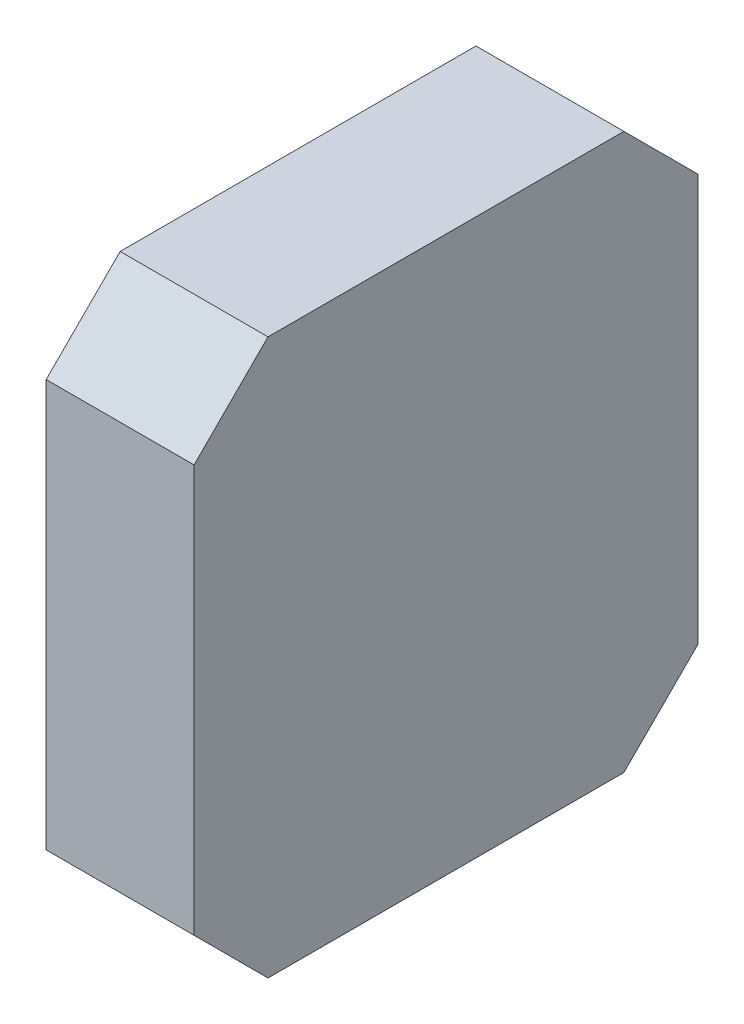
ISO-10303-21;
HEADER;
FILE_DESCRIPTION(('STEP AP214'),'2;1');
FILE_NAME('part.step','',(''),(''),'','','');
FILE_SCHEMA(('AUTOMOTIVE_DESIGN { 1 0 10303 214 1 1 1 1 }'));
ENDSEC;
DATA;
#1=APPLICATION_CONTEXT('core data for automotive mechanical design processes');
#2=APPLICATION_PROTOCOL_DEFINITION('international standard','automotive_design',2000,#1);
#3=PRODUCT_CONTEXT('',#1,'mechanical');
#4=PRODUCT('Part','Part','',(#3));
#5=PRODUCT_RELATED_PRODUCT_CATEGORY('part','',(#4));
#6=PRODUCT_DEFINITION_FORMATION('','',#4);
#7=PRODUCT_DEFINITION_CONTEXT('part definition',#1,'design');
#8=PRODUCT_DEFINITION('design','',#6,#7);
#9=PRODUCT_DEFINITION_SHAPE('','',#8);
#10=(LENGTH_UNIT() NAMED_UNIT(*) SI_UNIT(.MILLI.,.METRE.));
#11=(NAMED_UNIT(*) PLANE_ANGLE_UNIT() SI_UNIT($,.RADIAN.));
#12=(NAMED_UNIT(*) SI_UNIT($,.STERADIAN.) SOLID_ANGLE_UNIT());
#13=UNCERTAINTY_MEASURE_WITH_UNIT(LENGTH_MEASURE(1.E-05),#10,'distance_accuracy_value','');
#14=(GEOMETRIC_REPRESENTATION_CONTEXT(3) GLOBAL_UNCERTAINTY_ASSIGNED_CONTEXT((#13)) GLOBAL_UNIT_ASSIGNED_CONTEXT((#10,
#11,#12)) REPRESENTATION_CONTEXT('',''));
#15=CARTESIAN_POINT('',(0.,0.,0.));
#16=DIRECTION('',(0.,0.,1.));
#17=DIRECTION('',(1.,0.,0.));
#18=AXIS2_PLACEMENT_3D('',#15,#16,#17);
#19=CARTESIAN_POINT('',(30.,-75.085,68.12));
#20=DIRECTION('',(0.,0.,-1.));
#21=DIRECTION('',(-1.,0.,0.));
#22=AXIS2_PLACEMENT_3D('',#19,#20,#21);
#23=PLANE('',#22);
#24=DIRECTION('',(0.,-1.,0.));
#25=VECTOR('',#24,1.);
#26=CARTESIAN_POINT('',(0.,-75.085,68.12));
#27=LINE('',#26,#25);
#28=CARTESIAN_POINT('',(0.,55.085,68.12));
#29=VERTEX_POINT('',#28);
#30=CARTESIAN_POINT('',(0.,-55.085,68.12));
#31=VERTEX_POINT('',#30);
#32=EDGE_CURVE('E134',#29,#31,#27,.T.);
#33=ORIENTED_EDGE('',*,*,#32,.T.);
#34=DIRECTION('',(-1.,0.,0.));
#35=VECTOR('',#34,1.);
#36=CARTESIAN_POINT('',(30.,-55.085,68.12));
#37=LINE('',#36,#35);
#38=CARTESIAN_POINT('',(40.,-55.085,68.12));
#39=VERTEX_POINT('',#38);
#40=EDGE_CURVE('E128',#39,#31,#37,.T.);
#41=ORIENTED_EDGE('',*,*,#40,.F.);
#42=DIRECTION('',(0.,-1.,0.));
#43=VECTOR('',#42,1.);
#44=CARTESIAN_POINT('',(40.,-55.085,68.12));
#45=LINE('',#44,#43);
#46=CARTESIAN_POINT('',(40.,55.085,68.12));
#47=VERTEX_POINT('',#46);
#48=EDGE_CURVE('E132',#47,#39,#45,.T.);
#49=ORIENTED_EDGE('',*,*,#48,.F.);
#50=DIRECTION('',(-1.,0.,0.));
#51=VECTOR('',#50,1.);
#52=CARTESIAN_POINT('',(30.,55.085,68.12));
#53=LINE('',#52,#51);
#54=EDGE_CURVE('E201',#47,#29,#53,.T.);
#55=ORIENTED_EDGE('',*,*,#54,.T.);
#56=EDGE_LOOP('',(#33,#41,#49,#55));
#57=FACE_BOUND('',#56,.T.);
#58=ADVANCED_FACE('F39',(#57),#23,.F.);
#59=CARTESIAN_POINT('',(30.,-75.085,68.12));
#60=DIRECTION('',(0.,1.,0.));
#61=DIRECTION('',(0.,0.,1.));
#62=AXIS2_PLACEMENT_3D('',#59,#60,#61);
#63=PLANE('',#62);
#64=DIRECTION('',(-1.,0.,0.));
#65=VECTOR('',#64,1.);
#66=CARTESIAN_POINT('',(30.,-75.085,-48.12));
#67=LINE('',#66,#65);
#68=CARTESIAN_POINT('',(40.,-75.085,-48.12));
#69=VERTEX_POINT('',#68);
#70=CARTESIAN_POINT('',(0.,-75.085,-48.12));
#71=VERTEX_POINT('',#70);
#72=EDGE_CURVE('E205',#69,#71,#67,.T.);
#73=ORIENTED_EDGE('',*,*,#72,.F.);
#74=DIRECTION('',(0.,0.,-1.));
#75=VECTOR('',#74,1.);
#76=CARTESIAN_POINT('',(40.,-75.085,-48.12));
#77=LINE('',#76,#75);
#78=CARTESIAN_POINT('',(40.,-75.085,48.12));
#79=VERTEX_POINT('',#78);
#80=EDGE_CURVE('E147',#79,#69,#77,.T.);
#81=ORIENTED_EDGE('',*,*,#80,.F.);
#82=DIRECTION('',(-1.,0.,0.));
#83=VECTOR('',#82,1.);
#84=CARTESIAN_POINT('',(30.,-75.085,48.12));
#85=LINE('',#84,#83);
#86=CARTESIAN_POINT('',(0.,-75.085,48.12));
#87=VERTEX_POINT('',#86);
#88=EDGE_CURVE('E138',#79,#87,#85,.T.);
#89=ORIENTED_EDGE('',*,*,#88,.T.);
#90=DIRECTION('',(0.,0.,-1.));
#91=VECTOR('',#90,1.);
#92=CARTESIAN_POINT('',(0.,-75.085,68.12));
#93=LINE('',#92,#91);
#94=EDGE_CURVE('E220',#87,#71,#93,.T.);
#95=ORIENTED_EDGE('',*,*,#94,.T.);
#96=EDGE_LOOP('',(#73,#81,#89,#95));
#97=FACE_BOUND('',#96,.T.);
#98=ADVANCED_FACE('F244',(#97),#63,.F.);
#99=CARTESIAN_POINT('',(30.,-75.085,-68.12));
#100=DIRECTION('',(0.,0.,1.));
#101=DIRECTION('',(0.,-1.,0.));
#102=AXIS2_PLACEMENT_3D('',#99,#100,#101);
#103=PLANE('',#102);
#104=DIRECTION('',(-1.,0.,0.));
#105=VECTOR('',#104,1.);
#106=CARTESIAN_POINT('',(30.,55.085,-68.12));
#107=LINE('',#106,#105);
#108=CARTESIAN_POINT('',(40.,55.085,-68.12));
#109=VERTEX_POINT('',#108);
#110=CARTESIAN_POINT('',(0.,55.085,-68.12));
#111=VERTEX_POINT('',#110);
#112=EDGE_CURVE('E214',#109,#111,#107,.T.);
#113=ORIENTED_EDGE('',*,*,#112,.F.);
#114=DIRECTION('',(0.,1.,0.));
#115=VECTOR('',#114,1.);
#116=CARTESIAN_POINT('',(40.,55.085,-68.12));
#117=LINE('',#116,#115);
#118=CARTESIAN_POINT('',(40.,-55.085,-68.12));
#119=VERTEX_POINT('',#118);
#120=EDGE_CURVE('E160',#119,#109,#117,.T.);
#121=ORIENTED_EDGE('',*,*,#120,.F.);
#122=DIRECTION('',(-1.,0.,0.));
#123=VECTOR('',#122,1.);
#124=CARTESIAN_POINT('',(30.,-55.085,-68.12));
#125=LINE('',#124,#123);
#126=CARTESIAN_POINT('',(0.,-55.085,-68.12));
#127=VERTEX_POINT('',#126);
#128=EDGE_CURVE('E207',#119,#127,#125,.T.);
#129=ORIENTED_EDGE('',*,*,#128,.T.);
#130=DIRECTION('',(0.,1.,0.));
#131=VECTOR('',#130,1.);
#132=CARTESIAN_POINT('',(0.,-75.085,-68.12));
#133=LINE('',#132,#131);
#134=EDGE_CURVE('E46',#127,#111,#133,.T.);
#135=ORIENTED_EDGE('',*,*,#134,.T.);
#136=EDGE_LOOP('',(#113,#121,#129,#135));
#137=FACE_BOUND('',#136,.T.);
#138=ADVANCED_FACE('F225',(#137),#103,.F.);
#139=CARTESIAN_POINT('',(30.,75.085,68.12));
#140=DIRECTION('',(0.,-1.,0.));
#141=DIRECTION('',(0.,0.,-1.));
#142=AXIS2_PLACEMENT_3D('',#139,#140,#141);
#143=PLANE('',#142);
#144=DIRECTION('',(0.,0.,1.));
#145=VECTOR('',#144,1.);
#146=CARTESIAN_POINT('',(0.,75.085,68.12));
#147=LINE('',#146,#145);
#148=CARTESIAN_POINT('',(0.,75.085,-48.12));
#149=VERTEX_POINT('',#148);
#150=CARTESIAN_POINT('',(0.,75.085,48.12));
#151=VERTEX_POINT('',#150);
#152=EDGE_CURVE('E11',#149,#151,#147,.T.);
#153=ORIENTED_EDGE('',*,*,#152,.T.);
#154=DIRECTION('',(-1.,0.,0.));
#155=VECTOR('',#154,1.);
#156=CARTESIAN_POINT('',(30.,75.085,48.12));
#157=LINE('',#156,#155);
#158=CARTESIAN_POINT('',(40.,75.085,48.12));
#159=VERTEX_POINT('',#158);
#160=EDGE_CURVE('E199',#159,#151,#157,.T.);
#161=ORIENTED_EDGE('',*,*,#160,.F.);
#162=DIRECTION('',(0.,0.,1.));
#163=VECTOR('',#162,1.);
#164=CARTESIAN_POINT('',(40.,75.085,48.12));
#165=LINE('',#164,#163);
#166=CARTESIAN_POINT('',(40.,75.085,-48.12));
#167=VERTEX_POINT('',#166);
#168=EDGE_CURVE('E166',#167,#159,#165,.T.);
#169=ORIENTED_EDGE('',*,*,#168,.F.);
#170=DIRECTION('',(-1.,0.,0.));
#171=VECTOR('',#170,1.);
#172=CARTESIAN_POINT('',(30.,75.085,-48.12));
#173=LINE('',#172,#171);
#174=EDGE_CURVE('E215',#167,#149,#173,.T.);
#175=ORIENTED_EDGE('',*,*,#174,.T.);
#176=EDGE_LOOP('',(#153,#161,#169,#175));
#177=FACE_BOUND('',#176,.T.);
#178=ADVANCED_FACE('F240',(#177),#143,.F.);
#179=CARTESIAN_POINT('',(0.,0.,0.));
#180=DIRECTION('',(-1.,0.,0.));
#181=DIRECTION('',(0.,0.,1.));
#182=AXIS2_PLACEMENT_3D('',#179,#180,#181);
#183=PLANE('',#182);
#184=DIRECTION('',(0.,-0.707106781186547,-0.707106781186548));
#185=VECTOR('',#184,1.);
#186=CARTESIAN_POINT('',(0.,-75.085,48.12));
#187=LINE('',#186,#185);
#188=EDGE_CURVE('E137',#31,#87,#187,.T.);
#189=ORIENTED_EDGE('',*,*,#188,.F.);
#190=ORIENTED_EDGE('',*,*,#32,.F.);
#191=DIRECTION('',(0.,-0.707106781186548,0.707106781186547));
#192=VECTOR('',#191,1.);
#193=CARTESIAN_POINT('',(0.,55.085,68.12));
#194=LINE('',#193,#192);
#195=EDGE_CURVE('E178',#151,#29,#194,.T.);
#196=ORIENTED_EDGE('',*,*,#195,.F.);
#197=ORIENTED_EDGE('',*,*,#152,.F.);
#198=DIRECTION('',(0.,0.707106781186547,0.707106781186548));
#199=VECTOR('',#198,1.);
#200=CARTESIAN_POINT('',(0.,55.085,-68.12));
#201=LINE('',#200,#199);
#202=EDGE_CURVE('E190',#111,#149,#201,.T.);
#203=ORIENTED_EDGE('',*,*,#202,.F.);
#204=ORIENTED_EDGE('',*,*,#134,.F.);
#205=DIRECTION('',(0.,0.707106781186548,-0.707106781186547));
#206=VECTOR('',#205,1.);
#207=CARTESIAN_POINT('',(0.,-75.085,-48.12));
#208=LINE('',#207,#206);
#209=EDGE_CURVE('E203',#71,#127,#208,.T.);
#210=ORIENTED_EDGE('',*,*,#209,.F.);
#211=ORIENTED_EDGE('',*,*,#94,.F.);
#212=EDGE_LOOP('',(#189,#190,#196,#197,#203,#204,#210,#211));
#213=FACE_BOUND('',#212,.T.);
#214=DIRECTION('',(0.,1.,0.));
#215=VECTOR('',#214,1.);
#216=CARTESIAN_POINT('',(0.,-20.,29.49577004));
#217=LINE('',#216,#215);
#218=CARTESIAN_POINT('',(0.,-40.,29.49577004));
#219=VERTEX_POINT('',#218);
#220=CARTESIAN_POINT('',(0.,-20.,29.49577004));
#221=VERTEX_POINT('',#220);
#222=EDGE_CURVE('E61',#219,#221,#217,.T.);
#223=ORIENTED_EDGE('',*,*,#222,.F.);
#224=DIRECTION('',(0.,0.,1.));
#225=VECTOR('',#224,1.);
#226=CARTESIAN_POINT('',(0.,-40.,29.49577004));
#227=LINE('',#226,#225);
#228=CARTESIAN_POINT('',(0.,-40.,-4.50422996));
#229=VERTEX_POINT('',#228);
#230=EDGE_CURVE('E179',#229,#219,#227,.T.);
#231=ORIENTED_EDGE('',*,*,#230,.F.);
#232=DIRECTION('',(0.,-1.,0.));
#233=VECTOR('',#232,1.);
#234=CARTESIAN_POINT('',(0.,-20.,-4.50422996));
#235=LINE('',#234,#233);
#236=CARTESIAN_POINT('',(0.,-20.,-4.50422996));
#237=VERTEX_POINT('',#236);
#238=EDGE_CURVE('E182',#237,#229,#235,.T.);
#239=ORIENTED_EDGE('',*,*,#238,.F.);
#240=DIRECTION('',(0.,0.,-1.));
#241=VECTOR('',#240,1.);
#242=CARTESIAN_POINT('',(0.,-20.,-4.50422996));
#243=LINE('',#242,#241);
#244=EDGE_CURVE('E186',#221,#237,#243,.T.);
#245=ORIENTED_EDGE('',*,*,#244,.F.);
#246=EDGE_LOOP('',(#223,#231,#239,#245));
#247=FACE_BOUND('',#246,.T.);
#248=ADVANCED_FACE('F230',(#213,#247),#183,.T.);
#249=CARTESIAN_POINT('',(30.,55.085,-68.12));
#250=DIRECTION('',(0.,-0.707106781186548,0.707106781186547));
#251=DIRECTION('',(0.,-0.707106781186547,-0.707106781186548));
#252=AXIS2_PLACEMENT_3D('',#249,#250,#251);
#253=PLANE('',#252);
#254=ORIENTED_EDGE('',*,*,#202,.T.);
#255=ORIENTED_EDGE('',*,*,#174,.F.);
#256=DIRECTION('',(0.,0.707106781186547,0.707106781186548));
#257=VECTOR('',#256,1.);
#258=CARTESIAN_POINT('',(40.,75.085,-48.12));
#259=LINE('',#258,#257);
#260=EDGE_CURVE('E163',#109,#167,#259,.T.);
#261=ORIENTED_EDGE('',*,*,#260,.F.);
#262=ORIENTED_EDGE('',*,*,#112,.T.);
#263=EDGE_LOOP('',(#254,#255,#261,#262));
#264=FACE_BOUND('',#263,.T.);
#265=ADVANCED_FACE('F236',(#264),#253,.F.);
#266=CARTESIAN_POINT('',(30.,-20.,29.49577004));
#267=DIRECTION('',(0.,0.,1.));
#268=DIRECTION('',(1.,0.,0.));
#269=AXIS2_PLACEMENT_3D('',#266,#267,#268);
#270=PLANE('',#269);
#271=ORIENTED_EDGE('',*,*,#222,.T.);
#272=DIRECTION('',(-1.,0.,0.));
#273=VECTOR('',#272,1.);
#274=CARTESIAN_POINT('',(30.,-20.,29.49577004));
#275=LINE('',#274,#273);
#276=CARTESIAN_POINT('',(30.,-20.,29.49577004));
#277=VERTEX_POINT('',#276);
#278=EDGE_CURVE('E169',#277,#221,#275,.T.);
#279=ORIENTED_EDGE('',*,*,#278,.F.);
#280=DIRECTION('',(0.,1.,0.));
#281=VECTOR('',#280,1.);
#282=CARTESIAN_POINT('',(30.,-20.,29.49577004));
#283=LINE('',#282,#281);
#284=CARTESIAN_POINT('',(30.,-40.,29.49577004));
#285=VERTEX_POINT('',#284);
#286=EDGE_CURVE('E183',#285,#277,#283,.T.);
#287=ORIENTED_EDGE('',*,*,#286,.F.);
#288=DIRECTION('',(-1.,0.,0.));
#289=VECTOR('',#288,1.);
#290=CARTESIAN_POINT('',(30.,-40.,29.49577004));
#291=LINE('',#290,#289);
#292=EDGE_CURVE('E176',#285,#219,#291,.T.);
#293=ORIENTED_EDGE('',*,*,#292,.T.);
#294=EDGE_LOOP('',(#271,#279,#287,#293));
#295=FACE_BOUND('',#294,.T.);
#296=ADVANCED_FACE('F272',(#295),#270,.F.);
#297=CARTESIAN_POINT('',(30.,-40.,29.49577004));
#298=DIRECTION('',(0.,-1.,0.));
#299=DIRECTION('',(0.,0.,-1.));
#300=AXIS2_PLACEMENT_3D('',#297,#298,#299);
#301=PLANE('',#300);
#302=ORIENTED_EDGE('',*,*,#230,.T.);
#303=ORIENTED_EDGE('',*,*,#292,.F.);
#304=DIRECTION('',(0.,0.,1.));
#305=VECTOR('',#304,1.);
#306=CARTESIAN_POINT('',(30.,-40.,-4.50422996));
#307=LINE('',#306,#305);
#308=CARTESIAN_POINT('',(30.,-40.,-4.50422996));
#309=VERTEX_POINT('',#308);
#310=EDGE_CURVE('E171',#309,#285,#307,.T.);
#311=ORIENTED_EDGE('',*,*,#310,.F.);
#312=DIRECTION('',(-1.,0.,0.));
#313=VECTOR('',#312,1.);
#314=CARTESIAN_POINT('',(30.,-40.,-4.50422996));
#315=LINE('',#314,#313);
#316=EDGE_CURVE('E174',#309,#229,#315,.T.);
#317=ORIENTED_EDGE('',*,*,#316,.T.);
#318=EDGE_LOOP('',(#302,#303,#311,#317));
#319=FACE_BOUND('',#318,.T.);
#320=ADVANCED_FACE('F276',(#319),#301,.F.);
#321=CARTESIAN_POINT('',(30.,-20.,-4.50422996));
#322=DIRECTION('',(0.,0.,-1.));
#323=DIRECTION('',(-1.,0.,0.));
#324=AXIS2_PLACEMENT_3D('',#321,#322,#323);
#325=PLANE('',#324);
#326=ORIENTED_EDGE('',*,*,#238,.T.);
#327=ORIENTED_EDGE('',*,*,#316,.F.);
#328=DIRECTION('',(0.,-1.,0.));
#329=VECTOR('',#328,1.);
#330=CARTESIAN_POINT('',(30.,-20.,-4.50422996));
#331=LINE('',#330,#329);
#332=CARTESIAN_POINT('',(30.,-20.,-4.50422996));
#333=VERTEX_POINT('',#332);
#334=EDGE_CURVE('E53',#333,#309,#331,.T.);
#335=ORIENTED_EDGE('',*,*,#334,.F.);
#336=DIRECTION('',(-1.,0.,0.));
#337=VECTOR('',#336,1.);
#338=CARTESIAN_POINT('',(30.,-20.,-4.50422996));
#339=LINE('',#338,#337);
#340=EDGE_CURVE('E172',#333,#237,#339,.T.);
#341=ORIENTED_EDGE('',*,*,#340,.T.);
#342=EDGE_LOOP('',(#326,#327,#335,#341));
#343=FACE_BOUND('',#342,.T.);
#344=ADVANCED_FACE('F281',(#343),#325,.F.);
#345=CARTESIAN_POINT('',(30.,-20.,-4.50422996));
#346=DIRECTION('',(0.,1.,0.));
#347=DIRECTION('',(0.,0.,1.));
#348=AXIS2_PLACEMENT_3D('',#345,#346,#347);
#349=PLANE('',#348);
#350=ORIENTED_EDGE('',*,*,#244,.T.);
#351=ORIENTED_EDGE('',*,*,#340,.F.);
#352=DIRECTION('',(0.,0.,-1.));
#353=VECTOR('',#352,1.);
#354=CARTESIAN_POINT('',(30.,-20.,25.49577004));
#355=LINE('',#354,#353);
#356=EDGE_CURVE('E194',#277,#333,#355,.T.);
#357=ORIENTED_EDGE('',*,*,#356,.F.);
#358=ORIENTED_EDGE('',*,*,#278,.T.);
#359=EDGE_LOOP('',(#350,#351,#357,#358));
#360=FACE_BOUND('',#359,.T.);
#361=ADVANCED_FACE('F256',(#360),#349,.F.);
#362=CARTESIAN_POINT('',(30.,55.085,68.12));
#363=DIRECTION('',(0.,-0.707106781186547,-0.707106781186548));
#364=DIRECTION('',(0.,0.707106781186548,-0.707106781186547));
#365=AXIS2_PLACEMENT_3D('',#362,#363,#364);
#366=PLANE('',#365);
#367=ORIENTED_EDGE('',*,*,#195,.T.);
#368=ORIENTED_EDGE('',*,*,#54,.F.);
#369=DIRECTION('',(0.,-0.707106781186548,0.707106781186548));
#370=VECTOR('',#369,1.);
#371=CARTESIAN_POINT('',(40.,55.085,68.12));
#372=LINE('',#371,#370);
#373=EDGE_CURVE('E153',#159,#47,#372,.T.);
#374=ORIENTED_EDGE('',*,*,#373,.F.);
#375=ORIENTED_EDGE('',*,*,#160,.T.);
#376=EDGE_LOOP('',(#367,#368,#374,#375));
#377=FACE_BOUND('',#376,.T.);
#378=ADVANCED_FACE('F242',(#377),#366,.F.);
#379=CARTESIAN_POINT('',(30.,-75.085,-48.12));
#380=DIRECTION('',(0.,0.707106781186547,0.707106781186548));
#381=DIRECTION('',(0.,-0.707106781186548,0.707106781186547));
#382=AXIS2_PLACEMENT_3D('',#379,#380,#381);
#383=PLANE('',#382);
#384=ORIENTED_EDGE('',*,*,#209,.T.);
#385=ORIENTED_EDGE('',*,*,#128,.F.);
#386=DIRECTION('',(0.,0.707106781186548,-0.707106781186547));
#387=VECTOR('',#386,1.);
#388=CARTESIAN_POINT('',(40.,-55.085,-68.12));
#389=LINE('',#388,#387);
#390=EDGE_CURVE('E157',#69,#119,#389,.T.);
#391=ORIENTED_EDGE('',*,*,#390,.F.);
#392=ORIENTED_EDGE('',*,*,#72,.T.);
#393=EDGE_LOOP('',(#384,#385,#391,#392));
#394=FACE_BOUND('',#393,.T.);
#395=ADVANCED_FACE('F247',(#394),#383,.F.);
#396=CARTESIAN_POINT('',(30.,-75.085,48.12));
#397=DIRECTION('',(0.,0.707106781186548,-0.707106781186547));
#398=DIRECTION('',(0.,0.707106781186547,0.707106781186548));
#399=AXIS2_PLACEMENT_3D('',#396,#397,#398);
#400=PLANE('',#399);
#401=ORIENTED_EDGE('',*,*,#188,.T.);
#402=ORIENTED_EDGE('',*,*,#88,.F.);
#403=DIRECTION('',(0.,-0.707106781186548,-0.707106781186548));
#404=VECTOR('',#403,1.);
#405=CARTESIAN_POINT('',(40.,-75.085,48.12));
#406=LINE('',#405,#404);
#407=EDGE_CURVE('E141',#39,#79,#406,.T.);
#408=ORIENTED_EDGE('',*,*,#407,.F.);
#409=ORIENTED_EDGE('',*,*,#40,.T.);
#410=EDGE_LOOP('',(#401,#402,#408,#409));
#411=FACE_BOUND('',#410,.T.);
#412=ADVANCED_FACE('F142',(#411),#400,.F.);
#413=CARTESIAN_POINT('',(30.,0.,0.));
#414=DIRECTION('',(-1.,0.,0.));
#415=DIRECTION('',(0.,0.,1.));
#416=AXIS2_PLACEMENT_3D('',#413,#414,#415);
#417=PLANE('',#416);
#418=ORIENTED_EDGE('',*,*,#334,.T.);
#419=ORIENTED_EDGE('',*,*,#310,.T.);
#420=ORIENTED_EDGE('',*,*,#286,.T.);
#421=ORIENTED_EDGE('',*,*,#356,.T.);
#422=EDGE_LOOP('',(#418,#419,#420,#421));
#423=FACE_BOUND('',#422,.T.);
#424=ADVANCED_FACE('F254',(#423),#417,.T.);
#425=CARTESIAN_POINT('',(40.,0.,0.));
#426=DIRECTION('',(-1.,0.,0.));
#427=DIRECTION('',(0.,0.,1.));
#428=AXIS2_PLACEMENT_3D('',#425,#426,#427);
#429=PLANE('',#428);
#430=ORIENTED_EDGE('',*,*,#48,.T.);
#431=ORIENTED_EDGE('',*,*,#407,.T.);
#432=ORIENTED_EDGE('',*,*,#80,.T.);
#433=ORIENTED_EDGE('',*,*,#390,.T.);
#434=ORIENTED_EDGE('',*,*,#120,.T.);
#435=ORIENTED_EDGE('',*,*,#260,.T.);
#436=ORIENTED_EDGE('',*,*,#168,.T.);
#437=ORIENTED_EDGE('',*,*,#373,.T.);
#438=EDGE_LOOP('',(#430,#431,#432,#433,#434,#435,#436,#437));
#439=FACE_BOUND('',#438,.T.);
#440=ADVANCED_FACE('F150',(#439),#429,.F.);
#441=CLOSED_SHELL('',(#58,#98,#138,#178,#248,#265,#296,#320,#344,#361,#378,#395,#412,#424,#440));
#442=MANIFOLD_SOLID_BREP('B2',#441);
#443=ADVANCED_BREP_SHAPE_REPRESENTATION('',(#18,#442),#14);
#444=SHAPE_DEFINITION_REPRESENTATION(#9,#443);
ENDSEC;
END-ISO-10303-21;
